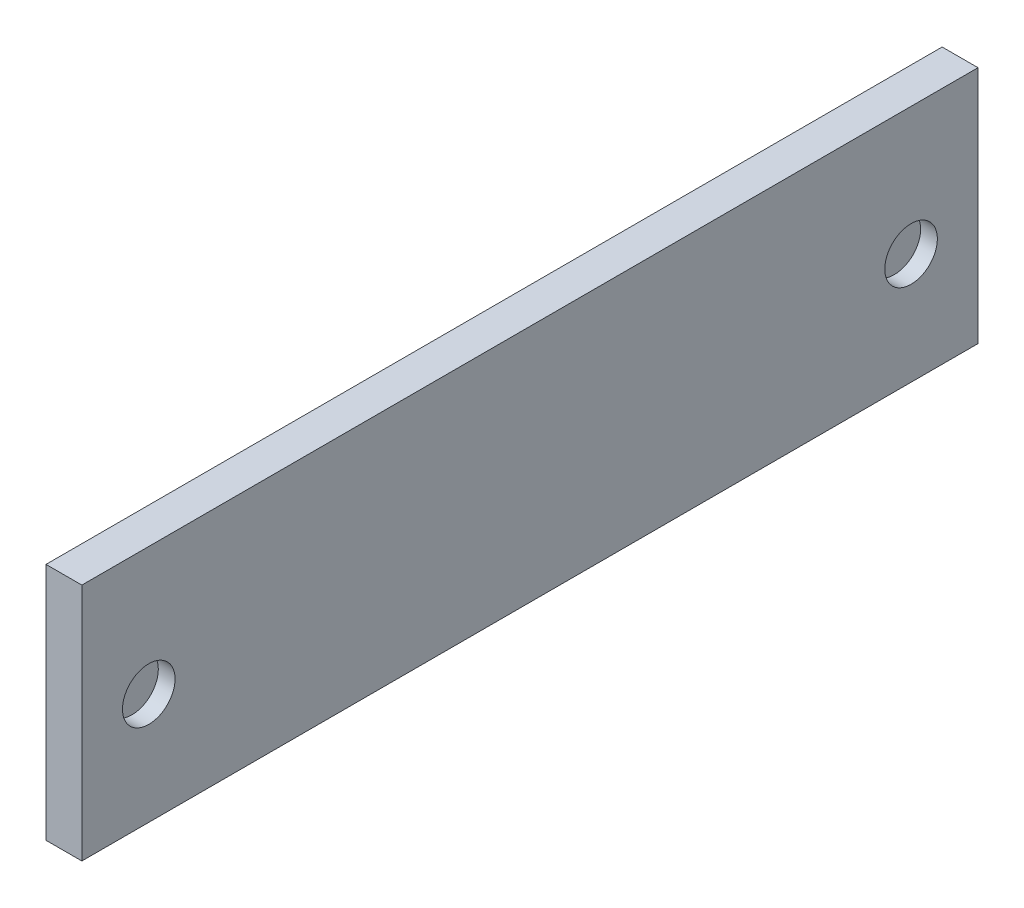
ISO-10303-21;
HEADER;
FILE_DESCRIPTION(('STEP AP214'),'2;1');
FILE_NAME('part.step','',(''),(''),'','','');
FILE_SCHEMA(('AUTOMOTIVE_DESIGN { 1 0 10303 214 1 1 1 1 }'));
ENDSEC;
DATA;
#1=APPLICATION_CONTEXT('core data for automotive mechanical design processes');
#2=APPLICATION_PROTOCOL_DEFINITION('international standard','automotive_design',2000,#1);
#3=PRODUCT_CONTEXT('',#1,'mechanical');
#4=PRODUCT('Part','Part','',(#3));
#5=PRODUCT_RELATED_PRODUCT_CATEGORY('part','',(#4));
#6=PRODUCT_DEFINITION_FORMATION('','',#4);
#7=PRODUCT_DEFINITION_CONTEXT('part definition',#1,'design');
#8=PRODUCT_DEFINITION('design','',#6,#7);
#9=PRODUCT_DEFINITION_SHAPE('','',#8);
#10=(LENGTH_UNIT() NAMED_UNIT(*) SI_UNIT(.MILLI.,.METRE.));
#11=(NAMED_UNIT(*) PLANE_ANGLE_UNIT() SI_UNIT($,.RADIAN.));
#12=(NAMED_UNIT(*) SI_UNIT($,.STERADIAN.) SOLID_ANGLE_UNIT());
#13=UNCERTAINTY_MEASURE_WITH_UNIT(LENGTH_MEASURE(1.E-05),#10,'distance_accuracy_value','');
#14=(GEOMETRIC_REPRESENTATION_CONTEXT(3) GLOBAL_UNCERTAINTY_ASSIGNED_CONTEXT((#13)) GLOBAL_UNIT_ASSIGNED_CONTEXT((#10,
#11,#12)) REPRESENTATION_CONTEXT('',''));
#15=CARTESIAN_POINT('',(0.,0.,0.));
#16=DIRECTION('',(0.,0.,1.));
#17=DIRECTION('',(1.,0.,0.));
#18=AXIS2_PLACEMENT_3D('',#15,#16,#17);
#19=CARTESIAN_POINT('',(15.,0.,0.));
#20=DIRECTION('',(0.,0.,-1.));
#21=DIRECTION('',(-1.,0.,0.));
#22=AXIS2_PLACEMENT_3D('',#19,#20,#21);
#23=PLANE('',#22);
#24=DIRECTION('',(0.,-1.,0.));
#25=VECTOR('',#24,1.);
#26=CARTESIAN_POINT('',(0.,0.,0.));
#27=LINE('',#26,#25);
#28=CARTESIAN_POINT('',(0.,100.,0.));
#29=VERTEX_POINT('',#28);
#30=CARTESIAN_POINT('',(0.,0.,0.));
#31=VERTEX_POINT('',#30);
#32=EDGE_CURVE('E95',#29,#31,#27,.T.);
#33=ORIENTED_EDGE('',*,*,#32,.T.);
#34=DIRECTION('',(-1.,0.,0.));
#35=VECTOR('',#34,1.);
#36=CARTESIAN_POINT('',(15.,0.,0.));
#37=LINE('',#36,#35);
#38=CARTESIAN_POINT('',(15.,0.,0.));
#39=VERTEX_POINT('',#38);
#40=EDGE_CURVE('E11',#39,#31,#37,.T.);
#41=ORIENTED_EDGE('',*,*,#40,.F.);
#42=DIRECTION('',(0.,-1.,0.));
#43=VECTOR('',#42,1.);
#44=CARTESIAN_POINT('',(15.,0.,0.));
#45=LINE('',#44,#43);
#46=CARTESIAN_POINT('',(15.,100.,0.));
#47=VERTEX_POINT('',#46);
#48=EDGE_CURVE('E83',#47,#39,#45,.T.);
#49=ORIENTED_EDGE('',*,*,#48,.F.);
#50=DIRECTION('',(-1.,0.,0.));
#51=VECTOR('',#50,1.);
#52=CARTESIAN_POINT('',(15.,100.,0.));
#53=LINE('',#52,#51);
#54=EDGE_CURVE('E91',#47,#29,#53,.T.);
#55=ORIENTED_EDGE('',*,*,#54,.T.);
#56=EDGE_LOOP('',(#33,#41,#49,#55));
#57=FACE_BOUND('',#56,.T.);
#58=ADVANCED_FACE('F32',(#57),#23,.F.);
#59=CARTESIAN_POINT('',(15.,0.,0.));
#60=DIRECTION('',(0.,1.,0.));
#61=DIRECTION('',(0.,0.,1.));
#62=AXIS2_PLACEMENT_3D('',#59,#60,#61);
#63=PLANE('',#62);
#64=DIRECTION('',(0.,0.,-1.));
#65=VECTOR('',#64,1.);
#66=CARTESIAN_POINT('',(0.,0.,0.));
#67=LINE('',#66,#65);
#68=CARTESIAN_POINT('',(0.,0.,-375.));
#69=VERTEX_POINT('',#68);
#70=EDGE_CURVE('E87',#31,#69,#67,.T.);
#71=ORIENTED_EDGE('',*,*,#70,.T.);
#72=DIRECTION('',(-1.,0.,0.));
#73=VECTOR('',#72,1.);
#74=CARTESIAN_POINT('',(15.,0.,-375.));
#75=LINE('',#74,#73);
#76=CARTESIAN_POINT('',(15.,0.,-375.));
#77=VERTEX_POINT('',#76);
#78=EDGE_CURVE('E40',#77,#69,#75,.T.);
#79=ORIENTED_EDGE('',*,*,#78,.F.);
#80=DIRECTION('',(0.,0.,-1.));
#81=VECTOR('',#80,1.);
#82=CARTESIAN_POINT('',(15.,0.,0.));
#83=LINE('',#82,#81);
#84=EDGE_CURVE('E78',#39,#77,#83,.T.);
#85=ORIENTED_EDGE('',*,*,#84,.F.);
#86=ORIENTED_EDGE('',*,*,#40,.T.);
#87=EDGE_LOOP('',(#71,#79,#85,#86));
#88=FACE_BOUND('',#87,.T.);
#89=ADVANCED_FACE('F86',(#88),#63,.F.);
#90=CARTESIAN_POINT('',(15.,0.,-375.));
#91=DIRECTION('',(0.,0.,1.));
#92=DIRECTION('',(1.,0.,0.));
#93=AXIS2_PLACEMENT_3D('',#90,#91,#92);
#94=PLANE('',#93);
#95=DIRECTION('',(0.,1.,0.));
#96=VECTOR('',#95,1.);
#97=CARTESIAN_POINT('',(0.,0.,-375.));
#98=LINE('',#97,#96);
#99=CARTESIAN_POINT('',(0.,100.,-375.));
#100=VERTEX_POINT('',#99);
#101=EDGE_CURVE('E65',#69,#100,#98,.T.);
#102=ORIENTED_EDGE('',*,*,#101,.T.);
#103=DIRECTION('',(-1.,0.,0.));
#104=VECTOR('',#103,1.);
#105=CARTESIAN_POINT('',(15.,100.,-375.));
#106=LINE('',#105,#104);
#107=CARTESIAN_POINT('',(15.,100.,-375.));
#108=VERTEX_POINT('',#107);
#109=EDGE_CURVE('E88',#108,#100,#106,.T.);
#110=ORIENTED_EDGE('',*,*,#109,.F.);
#111=DIRECTION('',(0.,1.,0.));
#112=VECTOR('',#111,1.);
#113=CARTESIAN_POINT('',(15.,0.,-375.));
#114=LINE('',#113,#112);
#115=EDGE_CURVE('E81',#77,#108,#114,.T.);
#116=ORIENTED_EDGE('',*,*,#115,.F.);
#117=ORIENTED_EDGE('',*,*,#78,.T.);
#118=EDGE_LOOP('',(#102,#110,#116,#117));
#119=FACE_BOUND('',#118,.T.);
#120=ADVANCED_FACE('F89',(#119),#94,.F.);
#121=CARTESIAN_POINT('',(15.,100.,0.));
#122=DIRECTION('',(0.,-1.,0.));
#123=DIRECTION('',(0.,0.,-1.));
#124=AXIS2_PLACEMENT_3D('',#121,#122,#123);
#125=PLANE('',#124);
#126=DIRECTION('',(0.,0.,1.));
#127=VECTOR('',#126,1.);
#128=CARTESIAN_POINT('',(0.,100.,0.));
#129=LINE('',#128,#127);
#130=EDGE_CURVE('E71',#100,#29,#129,.T.);
#131=ORIENTED_EDGE('',*,*,#130,.T.);
#132=ORIENTED_EDGE('',*,*,#54,.F.);
#133=DIRECTION('',(0.,0.,1.));
#134=VECTOR('',#133,1.);
#135=CARTESIAN_POINT('',(15.,100.,0.));
#136=LINE('',#135,#134);
#137=EDGE_CURVE('E48',#108,#47,#136,.T.);
#138=ORIENTED_EDGE('',*,*,#137,.F.);
#139=ORIENTED_EDGE('',*,*,#109,.T.);
#140=EDGE_LOOP('',(#131,#132,#138,#139));
#141=FACE_BOUND('',#140,.T.);
#142=ADVANCED_FACE('F103',(#141),#125,.F.);
#143=CARTESIAN_POINT('',(15.,0.,0.));
#144=DIRECTION('',(-1.,0.,0.));
#145=DIRECTION('',(0.,0.,1.));
#146=AXIS2_PLACEMENT_3D('',#143,#144,#145);
#147=PLANE('',#146);
#148=CARTESIAN_POINT('',(15.,46.5,-347.));
#149=DIRECTION('',(1.,0.,0.));
#150=DIRECTION('',(0.,0.,-1.));
#151=AXIS2_PLACEMENT_3D('',#148,#149,#150);
#152=CIRCLE('',#151,11.);
#153=CARTESIAN_POINT('',(15.,46.5,-358.));
#154=VERTEX_POINT('',#153);
#155=EDGE_CURVE('E115',#154,#154,#152,.T.);
#156=ORIENTED_EDGE('',*,*,#155,.F.);
#157=EDGE_LOOP('',(#156));
#158=FACE_BOUND('',#157,.T.);
#159=CARTESIAN_POINT('',(15.,46.5,-28.));
#160=DIRECTION('',(1.,0.,0.));
#161=DIRECTION('',(0.,0.,-1.));
#162=AXIS2_PLACEMENT_3D('',#159,#160,#161);
#163=CIRCLE('',#162,11.);
#164=CARTESIAN_POINT('',(15.,46.5,-39.));
#165=VERTEX_POINT('',#164);
#166=EDGE_CURVE('E109',#165,#165,#163,.T.);
#167=ORIENTED_EDGE('',*,*,#166,.F.);
#168=EDGE_LOOP('',(#167));
#169=FACE_BOUND('',#168,.T.);
#170=ORIENTED_EDGE('',*,*,#48,.T.);
#171=ORIENTED_EDGE('',*,*,#84,.T.);
#172=ORIENTED_EDGE('',*,*,#115,.T.);
#173=ORIENTED_EDGE('',*,*,#137,.T.);
#174=EDGE_LOOP('',(#170,#171,#172,#173));
#175=FACE_BOUND('',#174,.T.);
#176=ADVANCED_FACE('F79',(#158,#169,#175),#147,.F.);
#177=CARTESIAN_POINT('',(0.,0.,0.));
#178=DIRECTION('',(-1.,0.,0.));
#179=DIRECTION('',(0.,0.,1.));
#180=AXIS2_PLACEMENT_3D('',#177,#178,#179);
#181=PLANE('',#180);
#182=ORIENTED_EDGE('',*,*,#32,.F.);
#183=ORIENTED_EDGE('',*,*,#130,.F.);
#184=ORIENTED_EDGE('',*,*,#101,.F.);
#185=ORIENTED_EDGE('',*,*,#70,.F.);
#186=EDGE_LOOP('',(#182,#183,#184,#185));
#187=FACE_BOUND('',#186,.T.);
#188=ADVANCED_FACE('F106',(#187),#181,.T.);
#189=CARTESIAN_POINT('',(8.,46.5,-28.));
#190=DIRECTION('',(1.,0.,0.));
#191=DIRECTION('',(0.,0.,-1.));
#192=AXIS2_PLACEMENT_3D('',#189,#190,#191);
#193=CYLINDRICAL_SURFACE('',#192,11.);
#194=CARTESIAN_POINT('',(8.,46.5,-28.));
#195=DIRECTION('',(1.,0.,0.));
#196=DIRECTION('',(0.,0.,-1.));
#197=AXIS2_PLACEMENT_3D('',#194,#195,#196);
#198=CIRCLE('',#197,11.);
#199=CARTESIAN_POINT('',(8.,46.5,-39.));
#200=VERTEX_POINT('',#199);
#201=EDGE_CURVE('E98',#200,#200,#198,.T.);
#202=ORIENTED_EDGE('',*,*,#201,.F.);
#203=EDGE_LOOP('',(#202));
#204=FACE_BOUND('',#203,.T.);
#205=ORIENTED_EDGE('',*,*,#166,.T.);
#206=EDGE_LOOP('',(#205));
#207=FACE_BOUND('',#206,.T.);
#208=ADVANCED_FACE('F135',(#204,#207),#193,.F.);
#209=CARTESIAN_POINT('',(8.,46.5,-28.));
#210=DIRECTION('',(1.,0.,0.));
#211=DIRECTION('',(0.,0.,-1.));
#212=AXIS2_PLACEMENT_3D('',#209,#210,#211);
#213=PLANE('',#212);
#214=ORIENTED_EDGE('',*,*,#201,.T.);
#215=EDGE_LOOP('',(#214));
#216=FACE_BOUND('',#215,.T.);
#217=ADVANCED_FACE('F126',(#216),#213,.T.);
#218=CARTESIAN_POINT('',(8.,46.5,-347.));
#219=DIRECTION('',(1.,0.,0.));
#220=DIRECTION('',(0.,0.,-1.));
#221=AXIS2_PLACEMENT_3D('',#218,#219,#220);
#222=CYLINDRICAL_SURFACE('',#221,11.);
#223=CARTESIAN_POINT('',(8.,46.5,-347.));
#224=DIRECTION('',(1.,0.,0.));
#225=DIRECTION('',(0.,0.,-1.));
#226=AXIS2_PLACEMENT_3D('',#223,#224,#225);
#227=CIRCLE('',#226,11.);
#228=CARTESIAN_POINT('',(8.,46.5,-358.));
#229=VERTEX_POINT('',#228);
#230=EDGE_CURVE('E112',#229,#229,#227,.T.);
#231=ORIENTED_EDGE('',*,*,#230,.F.);
#232=EDGE_LOOP('',(#231));
#233=FACE_BOUND('',#232,.T.);
#234=ORIENTED_EDGE('',*,*,#155,.T.);
#235=EDGE_LOOP('',(#234));
#236=FACE_BOUND('',#235,.T.);
#237=ADVANCED_FACE('F123',(#233,#236),#222,.F.);
#238=CARTESIAN_POINT('',(8.,46.5,-347.));
#239=DIRECTION('',(1.,0.,0.));
#240=DIRECTION('',(0.,0.,-1.));
#241=AXIS2_PLACEMENT_3D('',#238,#239,#240);
#242=PLANE('',#241);
#243=ORIENTED_EDGE('',*,*,#230,.T.);
#244=EDGE_LOOP('',(#243));
#245=FACE_BOUND('',#244,.T.);
#246=ADVANCED_FACE('F121',(#245),#242,.T.);
#247=CLOSED_SHELL('',(#58,#89,#120,#142,#176,#188,#208,#217,#237,#246));
#248=MANIFOLD_SOLID_BREP('B2',#247);
#249=ADVANCED_BREP_SHAPE_REPRESENTATION('',(#18,#248),#14);
#250=SHAPE_DEFINITION_REPRESENTATION(#9,#249);
ENDSEC;
END-ISO-10303-21;
